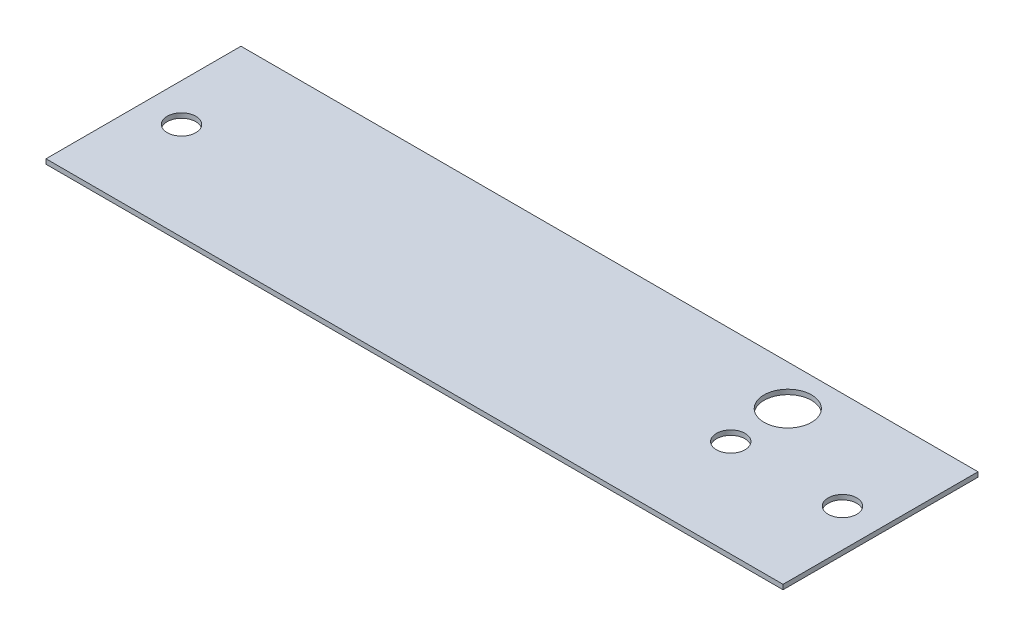
ISO-10303-21;
HEADER;
FILE_DESCRIPTION(('STEP AP214'),'2;1');
FILE_NAME('part.step','',(''),(''),'','','');
FILE_SCHEMA(('AUTOMOTIVE_DESIGN { 1 0 10303 214 1 1 1 1 }'));
ENDSEC;
DATA;
#1=APPLICATION_CONTEXT('core data for automotive mechanical design processes');
#2=APPLICATION_PROTOCOL_DEFINITION('international standard','automotive_design',2000,#1);
#3=PRODUCT_CONTEXT('',#1,'mechanical');
#4=PRODUCT('Part','Part','',(#3));
#5=PRODUCT_RELATED_PRODUCT_CATEGORY('part','',(#4));
#6=PRODUCT_DEFINITION_FORMATION('','',#4);
#7=PRODUCT_DEFINITION_CONTEXT('part definition',#1,'design');
#8=PRODUCT_DEFINITION('design','',#6,#7);
#9=PRODUCT_DEFINITION_SHAPE('','',#8);
#10=(LENGTH_UNIT() NAMED_UNIT(*) SI_UNIT(.MILLI.,.METRE.));
#11=(NAMED_UNIT(*) PLANE_ANGLE_UNIT() SI_UNIT($,.RADIAN.));
#12=(NAMED_UNIT(*) SI_UNIT($,.STERADIAN.) SOLID_ANGLE_UNIT());
#13=UNCERTAINTY_MEASURE_WITH_UNIT(LENGTH_MEASURE(1.E-05),#10,'distance_accuracy_value','');
#14=(GEOMETRIC_REPRESENTATION_CONTEXT(3) GLOBAL_UNCERTAINTY_ASSIGNED_CONTEXT((#13)) GLOBAL_UNIT_ASSIGNED_CONTEXT((#10,
#11,#12)) REPRESENTATION_CONTEXT('',''));
#15=CARTESIAN_POINT('',(0.,0.,0.));
#16=DIRECTION('',(0.,0.,1.));
#17=DIRECTION('',(1.,0.,0.));
#18=AXIS2_PLACEMENT_3D('',#15,#16,#17);
#19=CARTESIAN_POINT('',(-54.5461590524534,-0.5,14.6669881556684));
#20=DIRECTION('',(-1.,0.,0.));
#21=DIRECTION('',(0.,0.,1.));
#22=AXIS2_PLACEMENT_3D('',#19,#20,#21);
#23=PLANE('',#22);
#24=DIRECTION('',(0.,0.,1.));
#25=VECTOR('',#24,1.);
#26=CARTESIAN_POINT('',(-54.5461590524534,0.,14.6669881556684));
#27=LINE('',#26,#25);
#28=CARTESIAN_POINT('',(-54.5461590524534,0.,14.6669881556684));
#29=VERTEX_POINT('',#28);
#30=CARTESIAN_POINT('',(-54.5461590524534,0.,35.1669881556684));
#31=VERTEX_POINT('',#30);
#32=EDGE_CURVE('E99',#29,#31,#27,.T.);
#33=ORIENTED_EDGE('',*,*,#32,.F.);
#34=DIRECTION('',(0.,1.,0.));
#35=VECTOR('',#34,1.);
#36=CARTESIAN_POINT('',(-54.5461590524534,-0.5,14.6669881556684));
#37=LINE('',#36,#35);
#38=CARTESIAN_POINT('',(-54.5461590524534,-0.5,14.6669881556684));
#39=VERTEX_POINT('',#38);
#40=EDGE_CURVE('E11',#39,#29,#37,.T.);
#41=ORIENTED_EDGE('',*,*,#40,.F.);
#42=DIRECTION('',(0.,0.,1.));
#43=VECTOR('',#42,1.);
#44=CARTESIAN_POINT('',(-54.5461590524534,-0.5,14.6669881556684));
#45=LINE('',#44,#43);
#46=CARTESIAN_POINT('',(-54.5461590524534,-0.5,35.1669881556684));
#47=VERTEX_POINT('',#46);
#48=EDGE_CURVE('E92',#39,#47,#45,.T.);
#49=ORIENTED_EDGE('',*,*,#48,.T.);
#50=DIRECTION('',(0.,1.,0.));
#51=VECTOR('',#50,1.);
#52=CARTESIAN_POINT('',(-54.5461590524534,-0.5,35.1669881556684));
#53=LINE('',#52,#51);
#54=EDGE_CURVE('E37',#47,#31,#53,.T.);
#55=ORIENTED_EDGE('',*,*,#54,.T.);
#56=EDGE_LOOP('',(#33,#41,#49,#55));
#57=FACE_BOUND('',#56,.T.);
#58=ADVANCED_FACE('F34',(#57),#23,.T.);
#59=CARTESIAN_POINT('',(-54.5461590524534,-0.5,14.6669881556684));
#60=DIRECTION('',(0.,0.,-1.));
#61=DIRECTION('',(-1.,0.,0.));
#62=AXIS2_PLACEMENT_3D('',#59,#60,#61);
#63=PLANE('',#62);
#64=DIRECTION('',(-1.,0.,0.));
#65=VECTOR('',#64,1.);
#66=CARTESIAN_POINT('',(-54.5461590524534,0.,14.6669881556684));
#67=LINE('',#66,#65);
#68=CARTESIAN_POINT('',(22.9538409475466,0.,14.6669881556684));
#69=VERTEX_POINT('',#68);
#70=EDGE_CURVE('E94',#69,#29,#67,.T.);
#71=ORIENTED_EDGE('',*,*,#70,.F.);
#72=DIRECTION('',(0.,1.,0.));
#73=VECTOR('',#72,1.);
#74=CARTESIAN_POINT('',(22.9538409475466,-0.5,14.6669881556684));
#75=LINE('',#74,#73);
#76=CARTESIAN_POINT('',(22.9538409475466,-0.5,14.6669881556684));
#77=VERTEX_POINT('',#76);
#78=EDGE_CURVE('E43',#77,#69,#75,.T.);
#79=ORIENTED_EDGE('',*,*,#78,.F.);
#80=DIRECTION('',(-1.,0.,0.));
#81=VECTOR('',#80,1.);
#82=CARTESIAN_POINT('',(-54.5461590524534,-0.5,14.6669881556684));
#83=LINE('',#82,#81);
#84=EDGE_CURVE('E89',#77,#39,#83,.T.);
#85=ORIENTED_EDGE('',*,*,#84,.T.);
#86=ORIENTED_EDGE('',*,*,#40,.T.);
#87=EDGE_LOOP('',(#71,#79,#85,#86));
#88=FACE_BOUND('',#87,.T.);
#89=ADVANCED_FACE('F110',(#88),#63,.T.);
#90=CARTESIAN_POINT('',(22.9538409475466,-0.5,14.6669881556684));
#91=DIRECTION('',(1.,0.,0.));
#92=DIRECTION('',(0.,0.,-1.));
#93=AXIS2_PLACEMENT_3D('',#90,#91,#92);
#94=PLANE('',#93);
#95=DIRECTION('',(0.,0.,-1.));
#96=VECTOR('',#95,1.);
#97=CARTESIAN_POINT('',(22.9538409475466,0.,14.6669881556684));
#98=LINE('',#97,#96);
#99=CARTESIAN_POINT('',(22.9538409475466,0.,35.1669881556684));
#100=VERTEX_POINT('',#99);
#101=EDGE_CURVE('E84',#100,#69,#98,.T.);
#102=ORIENTED_EDGE('',*,*,#101,.F.);
#103=DIRECTION('',(0.,1.,0.));
#104=VECTOR('',#103,1.);
#105=CARTESIAN_POINT('',(22.9538409475466,-0.5,35.1669881556684));
#106=LINE('',#105,#104);
#107=CARTESIAN_POINT('',(22.9538409475466,-0.5,35.1669881556684));
#108=VERTEX_POINT('',#107);
#109=EDGE_CURVE('E79',#108,#100,#106,.T.);
#110=ORIENTED_EDGE('',*,*,#109,.F.);
#111=DIRECTION('',(0.,0.,-1.));
#112=VECTOR('',#111,1.);
#113=CARTESIAN_POINT('',(22.9538409475466,-0.5,14.6669881556684));
#114=LINE('',#113,#112);
#115=EDGE_CURVE('E82',#108,#77,#114,.T.);
#116=ORIENTED_EDGE('',*,*,#115,.T.);
#117=ORIENTED_EDGE('',*,*,#78,.T.);
#118=EDGE_LOOP('',(#102,#110,#116,#117));
#119=FACE_BOUND('',#118,.T.);
#120=ADVANCED_FACE('F81',(#119),#94,.T.);
#121=CARTESIAN_POINT('',(-54.5461590524534,-0.5,35.1669881556684));
#122=DIRECTION('',(0.,0.,1.));
#123=DIRECTION('',(1.,0.,0.));
#124=AXIS2_PLACEMENT_3D('',#121,#122,#123);
#125=PLANE('',#124);
#126=DIRECTION('',(1.,0.,0.));
#127=VECTOR('',#126,1.);
#128=CARTESIAN_POINT('',(-54.5461590524534,0.,35.1669881556684));
#129=LINE('',#128,#127);
#130=EDGE_CURVE('E102',#31,#100,#129,.T.);
#131=ORIENTED_EDGE('',*,*,#130,.F.);
#132=ORIENTED_EDGE('',*,*,#54,.F.);
#133=DIRECTION('',(1.,0.,0.));
#134=VECTOR('',#133,1.);
#135=CARTESIAN_POINT('',(-54.5461590524534,-0.5,35.1669881556684));
#136=LINE('',#135,#134);
#137=EDGE_CURVE('E88',#47,#108,#136,.T.);
#138=ORIENTED_EDGE('',*,*,#137,.T.);
#139=ORIENTED_EDGE('',*,*,#109,.T.);
#140=EDGE_LOOP('',(#131,#132,#138,#139));
#141=FACE_BOUND('',#140,.T.);
#142=ADVANCED_FACE('F91',(#141),#125,.T.);
#143=CARTESIAN_POINT('',(-54.5461590524534,-0.5,35.1669881556684));
#144=DIRECTION('',(0.,1.,0.));
#145=DIRECTION('',(0.,0.,1.));
#146=AXIS2_PLACEMENT_3D('',#143,#144,#145);
#147=PLANE('',#146);
#148=CARTESIAN_POINT('',(7.20384094754657,-0.5,18.9169881556684));
#149=DIRECTION('',(0.,1.,0.));
#150=DIRECTION('',(0.,0.,1.));
#151=AXIS2_PLACEMENT_3D('',#148,#149,#150);
#152=CIRCLE('',#151,2.5);
#153=CARTESIAN_POINT('',(7.20384094754657,-0.5,21.4169881556684));
#154=VERTEX_POINT('',#153);
#155=EDGE_CURVE('E154',#154,#154,#152,.T.);
#156=ORIENTED_EDGE('',*,*,#155,.T.);
#157=EDGE_LOOP('',(#156));
#158=FACE_BOUND('',#157,.T.);
#159=CARTESIAN_POINT('',(7.20384094754657,-0.5,24.9169881556684));
#160=DIRECTION('',(0.,1.,0.));
#161=DIRECTION('',(0.,0.,1.));
#162=AXIS2_PLACEMENT_3D('',#159,#160,#161);
#163=CIRCLE('',#162,1.5);
#164=CARTESIAN_POINT('',(7.20384094754657,-0.5,26.4169881556684));
#165=VERTEX_POINT('',#164);
#166=EDGE_CURVE('E158',#165,#165,#163,.T.);
#167=ORIENTED_EDGE('',*,*,#166,.T.);
#168=EDGE_LOOP('',(#167));
#169=FACE_BOUND('',#168,.T.);
#170=CARTESIAN_POINT('',(18.9538409475466,-0.5,24.9169881556684));
#171=DIRECTION('',(0.,1.,0.));
#172=DIRECTION('',(0.,0.,-1.));
#173=AXIS2_PLACEMENT_3D('',#170,#171,#172);
#174=CIRCLE('',#173,1.5);
#175=CARTESIAN_POINT('',(18.9538409475466,-0.5,23.4169881556684));
#176=VERTEX_POINT('',#175);
#177=EDGE_CURVE('E165',#176,#176,#174,.T.);
#178=ORIENTED_EDGE('',*,*,#177,.T.);
#179=EDGE_LOOP('',(#178));
#180=FACE_BOUND('',#179,.T.);
#181=CARTESIAN_POINT('',(-50.5461590524534,-0.5,24.9169881556684));
#182=DIRECTION('',(0.,1.,0.));
#183=DIRECTION('',(0.,0.,1.));
#184=AXIS2_PLACEMENT_3D('',#181,#182,#183);
#185=CIRCLE('',#184,1.5);
#186=CARTESIAN_POINT('',(-50.5461590524534,-0.5,26.4169881556684));
#187=VERTEX_POINT('',#186);
#188=EDGE_CURVE('E103',#187,#187,#185,.T.);
#189=ORIENTED_EDGE('',*,*,#188,.T.);
#190=EDGE_LOOP('',(#189));
#191=FACE_BOUND('',#190,.T.);
#192=ORIENTED_EDGE('',*,*,#48,.F.);
#193=ORIENTED_EDGE('',*,*,#84,.F.);
#194=ORIENTED_EDGE('',*,*,#115,.F.);
#195=ORIENTED_EDGE('',*,*,#137,.F.);
#196=EDGE_LOOP('',(#192,#193,#194,#195));
#197=FACE_BOUND('',#196,.T.);
#198=ADVANCED_FACE('F87',(#158,#169,#180,#191,#197),#147,.F.);
#199=CARTESIAN_POINT('',(-54.5461590524534,0.,35.1669881556684));
#200=DIRECTION('',(0.,1.,0.));
#201=DIRECTION('',(0.,0.,1.));
#202=AXIS2_PLACEMENT_3D('',#199,#200,#201);
#203=PLANE('',#202);
#204=CARTESIAN_POINT('',(7.20384094754657,0.,18.9169881556684));
#205=DIRECTION('',(0.,1.,0.));
#206=DIRECTION('',(0.,0.,1.));
#207=AXIS2_PLACEMENT_3D('',#204,#205,#206);
#208=CIRCLE('',#207,2.5);
#209=CARTESIAN_POINT('',(7.20384094754657,0.,21.4169881556684));
#210=VERTEX_POINT('',#209);
#211=EDGE_CURVE('E152',#210,#210,#208,.T.);
#212=ORIENTED_EDGE('',*,*,#211,.F.);
#213=EDGE_LOOP('',(#212));
#214=FACE_BOUND('',#213,.T.);
#215=CARTESIAN_POINT('',(7.20384094754657,0.,24.9169881556684));
#216=DIRECTION('',(0.,1.,0.));
#217=DIRECTION('',(0.,0.,1.));
#218=AXIS2_PLACEMENT_3D('',#215,#216,#217);
#219=CIRCLE('',#218,1.5);
#220=CARTESIAN_POINT('',(7.20384094754657,0.,26.4169881556684));
#221=VERTEX_POINT('',#220);
#222=EDGE_CURVE('E155',#221,#221,#219,.T.);
#223=ORIENTED_EDGE('',*,*,#222,.F.);
#224=EDGE_LOOP('',(#223));
#225=FACE_BOUND('',#224,.T.);
#226=CARTESIAN_POINT('',(18.9538409475466,0.,24.9169881556684));
#227=DIRECTION('',(0.,1.,0.));
#228=DIRECTION('',(0.,0.,-1.));
#229=AXIS2_PLACEMENT_3D('',#226,#227,#228);
#230=CIRCLE('',#229,1.5);
#231=CARTESIAN_POINT('',(18.9538409475466,0.,23.4169881556684));
#232=VERTEX_POINT('',#231);
#233=EDGE_CURVE('E164',#232,#232,#230,.T.);
#234=ORIENTED_EDGE('',*,*,#233,.F.);
#235=EDGE_LOOP('',(#234));
#236=FACE_BOUND('',#235,.T.);
#237=CARTESIAN_POINT('',(-50.5461590524534,0.,24.9169881556684));
#238=DIRECTION('',(0.,1.,0.));
#239=DIRECTION('',(0.,0.,1.));
#240=AXIS2_PLACEMENT_3D('',#237,#238,#239);
#241=CIRCLE('',#240,1.5);
#242=CARTESIAN_POINT('',(-50.5461590524534,0.,26.4169881556684));
#243=VERTEX_POINT('',#242);
#244=EDGE_CURVE('E168',#243,#243,#241,.T.);
#245=ORIENTED_EDGE('',*,*,#244,.F.);
#246=EDGE_LOOP('',(#245));
#247=FACE_BOUND('',#246,.T.);
#248=ORIENTED_EDGE('',*,*,#32,.T.);
#249=ORIENTED_EDGE('',*,*,#130,.T.);
#250=ORIENTED_EDGE('',*,*,#101,.T.);
#251=ORIENTED_EDGE('',*,*,#70,.T.);
#252=EDGE_LOOP('',(#248,#249,#250,#251));
#253=FACE_BOUND('',#252,.T.);
#254=ADVANCED_FACE('F109',(#214,#225,#236,#247,#253),#203,.T.);
#255=CARTESIAN_POINT('',(-50.5461590524534,-0.5,24.9169881556684));
#256=DIRECTION('',(0.,1.,0.));
#257=DIRECTION('',(0.,0.,1.));
#258=AXIS2_PLACEMENT_3D('',#255,#256,#257);
#259=CYLINDRICAL_SURFACE('',#258,1.5);
#260=ORIENTED_EDGE('',*,*,#188,.F.);
#261=EDGE_LOOP('',(#260));
#262=FACE_BOUND('',#261,.T.);
#263=ORIENTED_EDGE('',*,*,#244,.T.);
#264=EDGE_LOOP('',(#263));
#265=FACE_BOUND('',#264,.T.);
#266=ADVANCED_FACE('F128',(#262,#265),#259,.F.);
#267=CARTESIAN_POINT('',(18.9538409475466,-0.5,24.9169881556684));
#268=DIRECTION('',(0.,1.,0.));
#269=DIRECTION('',(0.,0.,1.));
#270=AXIS2_PLACEMENT_3D('',#267,#268,#269);
#271=CYLINDRICAL_SURFACE('',#270,1.5);
#272=ORIENTED_EDGE('',*,*,#177,.F.);
#273=EDGE_LOOP('',(#272));
#274=FACE_BOUND('',#273,.T.);
#275=ORIENTED_EDGE('',*,*,#233,.T.);
#276=EDGE_LOOP('',(#275));
#277=FACE_BOUND('',#276,.T.);
#278=ADVANCED_FACE('F135',(#274,#277),#271,.F.);
#279=CARTESIAN_POINT('',(7.20384094754657,-10.,24.9169881556684));
#280=DIRECTION('',(0.,1.,0.));
#281=DIRECTION('',(0.,0.,1.));
#282=AXIS2_PLACEMENT_3D('',#279,#280,#281);
#283=CYLINDRICAL_SURFACE('',#282,1.5);
#284=ORIENTED_EDGE('',*,*,#222,.T.);
#285=EDGE_LOOP('',(#284));
#286=FACE_BOUND('',#285,.T.);
#287=ORIENTED_EDGE('',*,*,#166,.F.);
#288=EDGE_LOOP('',(#287));
#289=FACE_BOUND('',#288,.T.);
#290=ADVANCED_FACE('F139',(#286,#289),#283,.F.);
#291=CARTESIAN_POINT('',(7.20384094754657,-10.,18.9169881556684));
#292=DIRECTION('',(0.,1.,0.));
#293=DIRECTION('',(0.,0.,1.));
#294=AXIS2_PLACEMENT_3D('',#291,#292,#293);
#295=CYLINDRICAL_SURFACE('',#294,2.5);
#296=ORIENTED_EDGE('',*,*,#211,.T.);
#297=EDGE_LOOP('',(#296));
#298=FACE_BOUND('',#297,.T.);
#299=ORIENTED_EDGE('',*,*,#155,.F.);
#300=EDGE_LOOP('',(#299));
#301=FACE_BOUND('',#300,.T.);
#302=ADVANCED_FACE('F143',(#298,#301),#295,.F.);
#303=CLOSED_SHELL('',(#58,#89,#120,#142,#198,#254,#266,#278,#290,#302));
#304=MANIFOLD_SOLID_BREP('B2',#303);
#305=ADVANCED_BREP_SHAPE_REPRESENTATION('',(#18,#304),#14);
#306=SHAPE_DEFINITION_REPRESENTATION(#9,#305);
ENDSEC;
END-ISO-10303-21;
